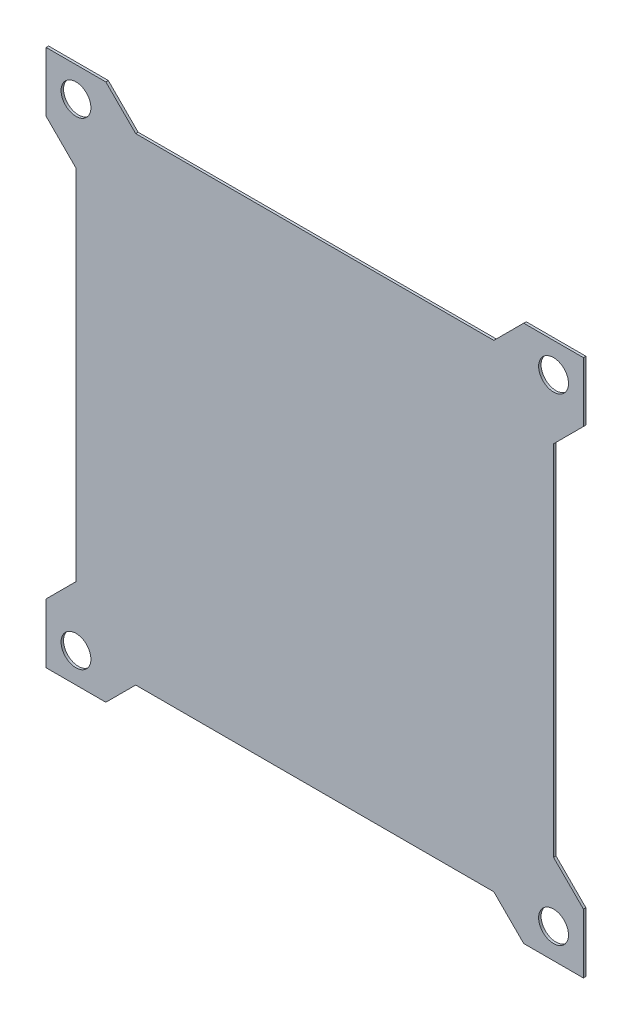
ISO-10303-21;
HEADER;
FILE_DESCRIPTION(('STEP AP214'),'2;1');
FILE_NAME('part.step','',(''),(''),'','','');
FILE_SCHEMA(('AUTOMOTIVE_DESIGN { 1 0 10303 214 1 1 1 1 }'));
ENDSEC;
DATA;
#1=APPLICATION_CONTEXT('core data for automotive mechanical design processes');
#2=APPLICATION_PROTOCOL_DEFINITION('international standard','automotive_design',2000,#1);
#3=PRODUCT_CONTEXT('',#1,'mechanical');
#4=PRODUCT('Part','Part','',(#3));
#5=PRODUCT_RELATED_PRODUCT_CATEGORY('part','',(#4));
#6=PRODUCT_DEFINITION_FORMATION('','',#4);
#7=PRODUCT_DEFINITION_CONTEXT('part definition',#1,'design');
#8=PRODUCT_DEFINITION('design','',#6,#7);
#9=PRODUCT_DEFINITION_SHAPE('','',#8);
#10=(LENGTH_UNIT() NAMED_UNIT(*) SI_UNIT(.MILLI.,.METRE.));
#11=(NAMED_UNIT(*) PLANE_ANGLE_UNIT() SI_UNIT($,.RADIAN.));
#12=(NAMED_UNIT(*) SI_UNIT($,.STERADIAN.) SOLID_ANGLE_UNIT());
#13=UNCERTAINTY_MEASURE_WITH_UNIT(LENGTH_MEASURE(1.E-05),#10,'distance_accuracy_value','');
#14=(GEOMETRIC_REPRESENTATION_CONTEXT(3) GLOBAL_UNCERTAINTY_ASSIGNED_CONTEXT((#13)) GLOBAL_UNIT_ASSIGNED_CONTEXT((#10,
#11,#12)) REPRESENTATION_CONTEXT('',''));
#15=CARTESIAN_POINT('',(0.,0.,0.));
#16=DIRECTION('',(0.,0.,1.));
#17=DIRECTION('',(1.,0.,0.));
#18=AXIS2_PLACEMENT_3D('',#15,#16,#17);
#19=CARTESIAN_POINT('',(90.,90.,0.41148));
#20=DIRECTION('',(-1.,0.,0.));
#21=DIRECTION('',(0.,0.,1.));
#22=AXIS2_PLACEMENT_3D('',#19,#20,#21);
#23=PLANE('',#22);
#24=DIRECTION('',(0.,1.,0.));
#25=VECTOR('',#24,1.);
#26=CARTESIAN_POINT('',(90.,90.,0.));
#27=LINE('',#26,#25);
#28=CARTESIAN_POINT('',(90.,80.,0.));
#29=VERTEX_POINT('',#28);
#30=CARTESIAN_POINT('',(90.,90.,0.));
#31=VERTEX_POINT('',#30);
#32=EDGE_CURVE('E3629',#29,#31,#27,.T.);
#33=ORIENTED_EDGE('',*,*,#32,.T.);
#34=DIRECTION('',(0.,0.,-1.));
#35=VECTOR('',#34,1.);
#36=CARTESIAN_POINT('',(90.,90.,0.41148));
#37=LINE('',#36,#35);
#38=CARTESIAN_POINT('',(90.,90.,0.41148));
#39=VERTEX_POINT('',#38);
#40=EDGE_CURVE('E3309',#39,#31,#37,.T.);
#41=ORIENTED_EDGE('',*,*,#40,.F.);
#42=DIRECTION('',(0.,1.,0.));
#43=VECTOR('',#42,1.);
#44=CARTESIAN_POINT('',(90.,90.,0.41148));
#45=LINE('',#44,#43);
#46=CARTESIAN_POINT('',(90.,80.,0.41148));
#47=VERTEX_POINT('',#46);
#48=EDGE_CURVE('E3688',#47,#39,#45,.T.);
#49=ORIENTED_EDGE('',*,*,#48,.F.);
#50=DIRECTION('',(0.,0.,-1.));
#51=VECTOR('',#50,1.);
#52=CARTESIAN_POINT('',(90.,80.,0.41148));
#53=LINE('',#52,#51);
#54=EDGE_CURVE('E3625',#47,#29,#53,.T.);
#55=ORIENTED_EDGE('',*,*,#54,.T.);
#56=EDGE_LOOP('',(#33,#41,#49,#55));
#57=FACE_BOUND('',#56,.T.);
#58=ADVANCED_FACE('F3456',(#57),#23,.F.);
#59=CARTESIAN_POINT('',(80.,90.,0.41148));
#60=DIRECTION('',(0.,-1.,0.));
#61=DIRECTION('',(0.,0.,-1.));
#62=AXIS2_PLACEMENT_3D('',#59,#60,#61);
#63=PLANE('',#62);
#64=DIRECTION('',(-1.,0.,0.));
#65=VECTOR('',#64,1.);
#66=CARTESIAN_POINT('',(80.,90.,0.));
#67=LINE('',#66,#65);
#68=CARTESIAN_POINT('',(80.,90.,0.));
#69=VERTEX_POINT('',#68);
#70=EDGE_CURVE('E3633',#31,#69,#67,.T.);
#71=ORIENTED_EDGE('',*,*,#70,.T.);
#72=DIRECTION('',(0.,0.,-1.));
#73=VECTOR('',#72,1.);
#74=CARTESIAN_POINT('',(80.,90.,0.41148));
#75=LINE('',#74,#73);
#76=CARTESIAN_POINT('',(80.,90.,0.41148));
#77=VERTEX_POINT('',#76);
#78=EDGE_CURVE('E3465',#77,#69,#75,.T.);
#79=ORIENTED_EDGE('',*,*,#78,.F.);
#80=DIRECTION('',(-1.,0.,0.));
#81=VECTOR('',#80,1.);
#82=CARTESIAN_POINT('',(80.,90.,0.41148));
#83=LINE('',#82,#81);
#84=EDGE_CURVE('E3552',#39,#77,#83,.T.);
#85=ORIENTED_EDGE('',*,*,#84,.F.);
#86=ORIENTED_EDGE('',*,*,#40,.T.);
#87=EDGE_LOOP('',(#71,#79,#85,#86));
#88=FACE_BOUND('',#87,.T.);
#89=ADVANCED_FACE('F3839',(#88),#63,.F.);
#90=CARTESIAN_POINT('',(75.,85.,0.41148));
#91=DIRECTION('',(0.707106781186546,-0.707106781186548,0.));
#92=DIRECTION('',(0.707106781186549,0.707106781186547,0.));
#93=AXIS2_PLACEMENT_3D('',#90,#91,#92);
#94=PLANE('',#93);
#95=DIRECTION('',(-0.707106781186548,-0.707106781186546,0.));
#96=VECTOR('',#95,1.);
#97=CARTESIAN_POINT('',(75.,85.,0.));
#98=LINE('',#97,#96);
#99=CARTESIAN_POINT('',(75.,85.,0.));
#100=VERTEX_POINT('',#99);
#101=EDGE_CURVE('E3637',#69,#100,#98,.T.);
#102=ORIENTED_EDGE('',*,*,#101,.T.);
#103=DIRECTION('',(0.,0.,-1.));
#104=VECTOR('',#103,1.);
#105=CARTESIAN_POINT('',(75.,85.,0.41148));
#106=LINE('',#105,#104);
#107=CARTESIAN_POINT('',(75.,85.,0.41148));
#108=VERTEX_POINT('',#107);
#109=EDGE_CURVE('E3747',#108,#100,#106,.T.);
#110=ORIENTED_EDGE('',*,*,#109,.F.);
#111=DIRECTION('',(-0.707106781186548,-0.707106781186546,0.));
#112=VECTOR('',#111,1.);
#113=CARTESIAN_POINT('',(75.,85.,0.41148));
#114=LINE('',#113,#112);
#115=EDGE_CURVE('E3757',#77,#108,#114,.T.);
#116=ORIENTED_EDGE('',*,*,#115,.F.);
#117=ORIENTED_EDGE('',*,*,#78,.T.);
#118=EDGE_LOOP('',(#102,#110,#116,#117));
#119=FACE_BOUND('',#118,.T.);
#120=ADVANCED_FACE('F3755',(#119),#94,.F.);
#121=CARTESIAN_POINT('',(15.,85.,0.41148));
#122=DIRECTION('',(0.,-1.,0.));
#123=DIRECTION('',(0.,0.,-1.));
#124=AXIS2_PLACEMENT_3D('',#121,#122,#123);
#125=PLANE('',#124);
#126=DIRECTION('',(-1.,0.,0.));
#127=VECTOR('',#126,1.);
#128=CARTESIAN_POINT('',(15.,85.,0.));
#129=LINE('',#128,#127);
#130=CARTESIAN_POINT('',(15.,85.,0.));
#131=VERTEX_POINT('',#130);
#132=EDGE_CURVE('E3640',#100,#131,#129,.T.);
#133=ORIENTED_EDGE('',*,*,#132,.T.);
#134=DIRECTION('',(0.,0.,-1.));
#135=VECTOR('',#134,1.);
#136=CARTESIAN_POINT('',(15.,85.,0.41148));
#137=LINE('',#136,#135);
#138=CARTESIAN_POINT('',(15.,85.,0.41148));
#139=VERTEX_POINT('',#138);
#140=EDGE_CURVE('E3743',#139,#131,#137,.T.);
#141=ORIENTED_EDGE('',*,*,#140,.F.);
#142=DIRECTION('',(-1.,0.,0.));
#143=VECTOR('',#142,1.);
#144=CARTESIAN_POINT('',(15.,85.,0.41148));
#145=LINE('',#144,#143);
#146=EDGE_CURVE('E3776',#108,#139,#145,.T.);
#147=ORIENTED_EDGE('',*,*,#146,.F.);
#148=ORIENTED_EDGE('',*,*,#109,.T.);
#149=EDGE_LOOP('',(#133,#141,#147,#148));
#150=FACE_BOUND('',#149,.T.);
#151=ADVANCED_FACE('F3766',(#150),#125,.F.);
#152=CARTESIAN_POINT('',(10.,90.,0.41148));
#153=DIRECTION('',(-0.707106781186547,-0.707106781186548,0.));
#154=DIRECTION('',(0.707106781186548,-0.707106781186547,0.));
#155=AXIS2_PLACEMENT_3D('',#152,#153,#154);
#156=PLANE('',#155);
#157=DIRECTION('',(-0.707106781186548,0.707106781186547,0.));
#158=VECTOR('',#157,1.);
#159=CARTESIAN_POINT('',(10.,90.,0.));
#160=LINE('',#159,#158);
#161=CARTESIAN_POINT('',(10.,90.,0.));
#162=VERTEX_POINT('',#161);
#163=EDGE_CURVE('E3643',#131,#162,#160,.T.);
#164=ORIENTED_EDGE('',*,*,#163,.T.);
#165=DIRECTION('',(0.,0.,-1.));
#166=VECTOR('',#165,1.);
#167=CARTESIAN_POINT('',(10.,90.,0.41148));
#168=LINE('',#167,#166);
#169=CARTESIAN_POINT('',(10.,90.,0.41148));
#170=VERTEX_POINT('',#169);
#171=EDGE_CURVE('E3739',#170,#162,#168,.T.);
#172=ORIENTED_EDGE('',*,*,#171,.F.);
#173=DIRECTION('',(-0.707106781186548,0.707106781186547,0.));
#174=VECTOR('',#173,1.);
#175=CARTESIAN_POINT('',(10.,90.,0.41148));
#176=LINE('',#175,#174);
#177=EDGE_CURVE('E3772',#139,#170,#176,.T.);
#178=ORIENTED_EDGE('',*,*,#177,.F.);
#179=ORIENTED_EDGE('',*,*,#140,.T.);
#180=EDGE_LOOP('',(#164,#172,#178,#179));
#181=FACE_BOUND('',#180,.T.);
#182=ADVANCED_FACE('F3770',(#181),#156,.F.);
#183=CARTESIAN_POINT('',(0.,90.,0.41148));
#184=DIRECTION('',(0.,-1.,0.));
#185=DIRECTION('',(0.,0.,-1.));
#186=AXIS2_PLACEMENT_3D('',#183,#184,#185);
#187=PLANE('',#186);
#188=DIRECTION('',(-1.,0.,0.));
#189=VECTOR('',#188,1.);
#190=CARTESIAN_POINT('',(0.,90.,0.));
#191=LINE('',#190,#189);
#192=CARTESIAN_POINT('',(0.,90.,0.));
#193=VERTEX_POINT('',#192);
#194=EDGE_CURVE('E3646',#162,#193,#191,.T.);
#195=ORIENTED_EDGE('',*,*,#194,.T.);
#196=DIRECTION('',(0.,0.,-1.));
#197=VECTOR('',#196,1.);
#198=CARTESIAN_POINT('',(0.,90.,0.41148));
#199=LINE('',#198,#197);
#200=CARTESIAN_POINT('',(0.,90.,0.41148));
#201=VERTEX_POINT('',#200);
#202=EDGE_CURVE('E3735',#201,#193,#199,.T.);
#203=ORIENTED_EDGE('',*,*,#202,.F.);
#204=DIRECTION('',(-1.,0.,0.));
#205=VECTOR('',#204,1.);
#206=CARTESIAN_POINT('',(0.,90.,0.41148));
#207=LINE('',#206,#205);
#208=EDGE_CURVE('E3775',#170,#201,#207,.T.);
#209=ORIENTED_EDGE('',*,*,#208,.F.);
#210=ORIENTED_EDGE('',*,*,#171,.T.);
#211=EDGE_LOOP('',(#195,#203,#209,#210));
#212=FACE_BOUND('',#211,.T.);
#213=ADVANCED_FACE('F3852',(#212),#187,.F.);
#214=CARTESIAN_POINT('',(0.,80.,0.41148));
#215=DIRECTION('',(1.,0.,0.));
#216=DIRECTION('',(0.,0.,-1.));
#217=AXIS2_PLACEMENT_3D('',#214,#215,#216);
#218=PLANE('',#217);
#219=DIRECTION('',(0.,-1.,0.));
#220=VECTOR('',#219,1.);
#221=CARTESIAN_POINT('',(0.,80.,0.));
#222=LINE('',#221,#220);
#223=CARTESIAN_POINT('',(0.,80.,0.));
#224=VERTEX_POINT('',#223);
#225=EDGE_CURVE('E3649',#193,#224,#222,.T.);
#226=ORIENTED_EDGE('',*,*,#225,.T.);
#227=DIRECTION('',(0.,0.,-1.));
#228=VECTOR('',#227,1.);
#229=CARTESIAN_POINT('',(0.,80.,0.41148));
#230=LINE('',#229,#228);
#231=CARTESIAN_POINT('',(0.,80.,0.41148));
#232=VERTEX_POINT('',#231);
#233=EDGE_CURVE('E3731',#232,#224,#230,.T.);
#234=ORIENTED_EDGE('',*,*,#233,.F.);
#235=DIRECTION('',(0.,-1.,0.));
#236=VECTOR('',#235,1.);
#237=CARTESIAN_POINT('',(0.,80.,0.41148));
#238=LINE('',#237,#236);
#239=EDGE_CURVE('E3780',#201,#232,#238,.T.);
#240=ORIENTED_EDGE('',*,*,#239,.F.);
#241=ORIENTED_EDGE('',*,*,#202,.T.);
#242=EDGE_LOOP('',(#226,#234,#240,#241));
#243=FACE_BOUND('',#242,.T.);
#244=ADVANCED_FACE('F3855',(#243),#218,.F.);
#245=CARTESIAN_POINT('',(5.,75.,0.41148));
#246=DIRECTION('',(0.707106781186548,0.707106781186547,0.));
#247=DIRECTION('',(-0.707106781186547,0.707106781186548,0.));
#248=AXIS2_PLACEMENT_3D('',#245,#246,#247);
#249=PLANE('',#248);
#250=DIRECTION('',(0.707106781186547,-0.707106781186548,0.));
#251=VECTOR('',#250,1.);
#252=CARTESIAN_POINT('',(5.,75.,0.));
#253=LINE('',#252,#251);
#254=CARTESIAN_POINT('',(5.,75.,0.));
#255=VERTEX_POINT('',#254);
#256=EDGE_CURVE('E3652',#224,#255,#253,.T.);
#257=ORIENTED_EDGE('',*,*,#256,.T.);
#258=DIRECTION('',(0.,0.,-1.));
#259=VECTOR('',#258,1.);
#260=CARTESIAN_POINT('',(5.,75.,0.41148));
#261=LINE('',#260,#259);
#262=CARTESIAN_POINT('',(5.,75.,0.41148));
#263=VERTEX_POINT('',#262);
#264=EDGE_CURVE('E3727',#263,#255,#261,.T.);
#265=ORIENTED_EDGE('',*,*,#264,.F.);
#266=DIRECTION('',(0.707106781186547,-0.707106781186548,0.));
#267=VECTOR('',#266,1.);
#268=CARTESIAN_POINT('',(5.,75.,0.41148));
#269=LINE('',#268,#267);
#270=EDGE_CURVE('E3787',#232,#263,#269,.T.);
#271=ORIENTED_EDGE('',*,*,#270,.F.);
#272=ORIENTED_EDGE('',*,*,#233,.T.);
#273=EDGE_LOOP('',(#257,#265,#271,#272));
#274=FACE_BOUND('',#273,.T.);
#275=ADVANCED_FACE('F3859',(#274),#249,.F.);
#276=CARTESIAN_POINT('',(5.,15.,0.41148));
#277=DIRECTION('',(1.,0.,0.));
#278=DIRECTION('',(0.,0.,-1.));
#279=AXIS2_PLACEMENT_3D('',#276,#277,#278);
#280=PLANE('',#279);
#281=DIRECTION('',(0.,-1.,0.));
#282=VECTOR('',#281,1.);
#283=CARTESIAN_POINT('',(5.,15.,0.));
#284=LINE('',#283,#282);
#285=CARTESIAN_POINT('',(5.,15.,0.));
#286=VERTEX_POINT('',#285);
#287=EDGE_CURVE('E3655',#255,#286,#284,.T.);
#288=ORIENTED_EDGE('',*,*,#287,.T.);
#289=DIRECTION('',(0.,0.,-1.));
#290=VECTOR('',#289,1.);
#291=CARTESIAN_POINT('',(5.,15.,0.41148));
#292=LINE('',#291,#290);
#293=CARTESIAN_POINT('',(5.,15.,0.41148));
#294=VERTEX_POINT('',#293);
#295=EDGE_CURVE('E3723',#294,#286,#292,.T.);
#296=ORIENTED_EDGE('',*,*,#295,.F.);
#297=DIRECTION('',(0.,-1.,0.));
#298=VECTOR('',#297,1.);
#299=CARTESIAN_POINT('',(5.,15.,0.41148));
#300=LINE('',#299,#298);
#301=EDGE_CURVE('E3790',#263,#294,#300,.T.);
#302=ORIENTED_EDGE('',*,*,#301,.F.);
#303=ORIENTED_EDGE('',*,*,#264,.T.);
#304=EDGE_LOOP('',(#288,#296,#302,#303));
#305=FACE_BOUND('',#304,.T.);
#306=ADVANCED_FACE('F3863',(#305),#280,.F.);
#307=CARTESIAN_POINT('',(0.,10.,0.41148));
#308=DIRECTION('',(0.707106781186547,-0.707106781186548,0.));
#309=DIRECTION('',(0.707106781186548,0.707106781186547,0.));
#310=AXIS2_PLACEMENT_3D('',#307,#308,#309);
#311=PLANE('',#310);
#312=DIRECTION('',(-0.707106781186548,-0.707106781186547,0.));
#313=VECTOR('',#312,1.);
#314=CARTESIAN_POINT('',(0.,10.,0.));
#315=LINE('',#314,#313);
#316=CARTESIAN_POINT('',(0.,10.,0.));
#317=VERTEX_POINT('',#316);
#318=EDGE_CURVE('E3658',#286,#317,#315,.T.);
#319=ORIENTED_EDGE('',*,*,#318,.T.);
#320=DIRECTION('',(0.,0.,-1.));
#321=VECTOR('',#320,1.);
#322=CARTESIAN_POINT('',(0.,10.,0.41148));
#323=LINE('',#322,#321);
#324=CARTESIAN_POINT('',(0.,10.,0.41148));
#325=VERTEX_POINT('',#324);
#326=EDGE_CURVE('E3719',#325,#317,#323,.T.);
#327=ORIENTED_EDGE('',*,*,#326,.F.);
#328=DIRECTION('',(-0.707106781186548,-0.707106781186547,0.));
#329=VECTOR('',#328,1.);
#330=CARTESIAN_POINT('',(0.,10.,0.41148));
#331=LINE('',#330,#329);
#332=EDGE_CURVE('E3793',#294,#325,#331,.T.);
#333=ORIENTED_EDGE('',*,*,#332,.F.);
#334=ORIENTED_EDGE('',*,*,#295,.T.);
#335=EDGE_LOOP('',(#319,#327,#333,#334));
#336=FACE_BOUND('',#335,.T.);
#337=ADVANCED_FACE('F3867',(#336),#311,.F.);
#338=CARTESIAN_POINT('',(0.,0.,0.41148));
#339=DIRECTION('',(1.,0.,0.));
#340=DIRECTION('',(0.,0.,-1.));
#341=AXIS2_PLACEMENT_3D('',#338,#339,#340);
#342=PLANE('',#341);
#343=DIRECTION('',(0.,-1.,0.));
#344=VECTOR('',#343,1.);
#345=CARTESIAN_POINT('',(0.,0.,0.));
#346=LINE('',#345,#344);
#347=CARTESIAN_POINT('',(0.,0.,0.));
#348=VERTEX_POINT('',#347);
#349=EDGE_CURVE('E3661',#317,#348,#346,.T.);
#350=ORIENTED_EDGE('',*,*,#349,.T.);
#351=DIRECTION('',(0.,0.,-1.));
#352=VECTOR('',#351,1.);
#353=CARTESIAN_POINT('',(0.,0.,0.41148));
#354=LINE('',#353,#352);
#355=CARTESIAN_POINT('',(0.,0.,0.41148));
#356=VERTEX_POINT('',#355);
#357=EDGE_CURVE('E3715',#356,#348,#354,.T.);
#358=ORIENTED_EDGE('',*,*,#357,.F.);
#359=DIRECTION('',(0.,-1.,0.));
#360=VECTOR('',#359,1.);
#361=CARTESIAN_POINT('',(0.,0.,0.41148));
#362=LINE('',#361,#360);
#363=EDGE_CURVE('E3796',#325,#356,#362,.T.);
#364=ORIENTED_EDGE('',*,*,#363,.F.);
#365=ORIENTED_EDGE('',*,*,#326,.T.);
#366=EDGE_LOOP('',(#350,#358,#364,#365));
#367=FACE_BOUND('',#366,.T.);
#368=ADVANCED_FACE('F3871',(#367),#342,.F.);
#369=CARTESIAN_POINT('',(10.,0.,0.41148));
#370=DIRECTION('',(0.,1.,0.));
#371=DIRECTION('',(0.,0.,1.));
#372=AXIS2_PLACEMENT_3D('',#369,#370,#371);
#373=PLANE('',#372);
#374=DIRECTION('',(1.,0.,0.));
#375=VECTOR('',#374,1.);
#376=CARTESIAN_POINT('',(10.,0.,0.));
#377=LINE('',#376,#375);
#378=CARTESIAN_POINT('',(10.,0.,0.));
#379=VERTEX_POINT('',#378);
#380=EDGE_CURVE('E3664',#348,#379,#377,.T.);
#381=ORIENTED_EDGE('',*,*,#380,.T.);
#382=DIRECTION('',(0.,0.,-1.));
#383=VECTOR('',#382,1.);
#384=CARTESIAN_POINT('',(10.,0.,0.41148));
#385=LINE('',#384,#383);
#386=CARTESIAN_POINT('',(10.,0.,0.41148));
#387=VERTEX_POINT('',#386);
#388=EDGE_CURVE('E3711',#387,#379,#385,.T.);
#389=ORIENTED_EDGE('',*,*,#388,.F.);
#390=DIRECTION('',(1.,0.,0.));
#391=VECTOR('',#390,1.);
#392=CARTESIAN_POINT('',(10.,0.,0.41148));
#393=LINE('',#392,#391);
#394=EDGE_CURVE('E3799',#356,#387,#393,.T.);
#395=ORIENTED_EDGE('',*,*,#394,.F.);
#396=ORIENTED_EDGE('',*,*,#357,.T.);
#397=EDGE_LOOP('',(#381,#389,#395,#396));
#398=FACE_BOUND('',#397,.T.);
#399=ADVANCED_FACE('F3875',(#398),#373,.F.);
#400=CARTESIAN_POINT('',(15.,5.,0.41148));
#401=DIRECTION('',(-0.707106781186548,0.707106781186547,0.));
#402=DIRECTION('',(-0.707106781186547,-0.707106781186548,0.));
#403=AXIS2_PLACEMENT_3D('',#400,#401,#402);
#404=PLANE('',#403);
#405=DIRECTION('',(0.707106781186547,0.707106781186548,0.));
#406=VECTOR('',#405,1.);
#407=CARTESIAN_POINT('',(15.,5.,0.));
#408=LINE('',#407,#406);
#409=CARTESIAN_POINT('',(15.,5.,0.));
#410=VERTEX_POINT('',#409);
#411=EDGE_CURVE('E3667',#379,#410,#408,.T.);
#412=ORIENTED_EDGE('',*,*,#411,.T.);
#413=DIRECTION('',(0.,0.,-1.));
#414=VECTOR('',#413,1.);
#415=CARTESIAN_POINT('',(15.,5.,0.41148));
#416=LINE('',#415,#414);
#417=CARTESIAN_POINT('',(15.,5.,0.41148));
#418=VERTEX_POINT('',#417);
#419=EDGE_CURVE('E3707',#418,#410,#416,.T.);
#420=ORIENTED_EDGE('',*,*,#419,.F.);
#421=DIRECTION('',(0.707106781186547,0.707106781186548,0.));
#422=VECTOR('',#421,1.);
#423=CARTESIAN_POINT('',(15.,5.,0.41148));
#424=LINE('',#423,#422);
#425=EDGE_CURVE('E3802',#387,#418,#424,.T.);
#426=ORIENTED_EDGE('',*,*,#425,.F.);
#427=ORIENTED_EDGE('',*,*,#388,.T.);
#428=EDGE_LOOP('',(#412,#420,#426,#427));
#429=FACE_BOUND('',#428,.T.);
#430=ADVANCED_FACE('F3879',(#429),#404,.F.);
#431=CARTESIAN_POINT('',(75.,5.,0.41148));
#432=DIRECTION('',(0.,1.,0.));
#433=DIRECTION('',(0.,0.,1.));
#434=AXIS2_PLACEMENT_3D('',#431,#432,#433);
#435=PLANE('',#434);
#436=DIRECTION('',(1.,0.,0.));
#437=VECTOR('',#436,1.);
#438=CARTESIAN_POINT('',(75.,5.,0.));
#439=LINE('',#438,#437);
#440=CARTESIAN_POINT('',(75.,5.,0.));
#441=VERTEX_POINT('',#440);
#442=EDGE_CURVE('E3670',#410,#441,#439,.T.);
#443=ORIENTED_EDGE('',*,*,#442,.T.);
#444=DIRECTION('',(0.,0.,-1.));
#445=VECTOR('',#444,1.);
#446=CARTESIAN_POINT('',(75.,5.,0.41148));
#447=LINE('',#446,#445);
#448=CARTESIAN_POINT('',(75.,5.,0.41148));
#449=VERTEX_POINT('',#448);
#450=EDGE_CURVE('E3703',#449,#441,#447,.T.);
#451=ORIENTED_EDGE('',*,*,#450,.F.);
#452=DIRECTION('',(1.,0.,0.));
#453=VECTOR('',#452,1.);
#454=CARTESIAN_POINT('',(75.,5.,0.41148));
#455=LINE('',#454,#453);
#456=EDGE_CURVE('E3805',#418,#449,#455,.T.);
#457=ORIENTED_EDGE('',*,*,#456,.F.);
#458=ORIENTED_EDGE('',*,*,#419,.T.);
#459=EDGE_LOOP('',(#443,#451,#457,#458));
#460=FACE_BOUND('',#459,.T.);
#461=ADVANCED_FACE('F3883',(#460),#435,.F.);
#462=CARTESIAN_POINT('',(80.,0.,0.41148));
#463=DIRECTION('',(0.707106781186547,0.707106781186548,0.));
#464=DIRECTION('',(-0.707106781186548,0.707106781186547,0.));
#465=AXIS2_PLACEMENT_3D('',#462,#463,#464);
#466=PLANE('',#465);
#467=DIRECTION('',(0.707106781186548,-0.707106781186547,0.));
#468=VECTOR('',#467,1.);
#469=CARTESIAN_POINT('',(80.,0.,0.));
#470=LINE('',#469,#468);
#471=CARTESIAN_POINT('',(80.,0.,0.));
#472=VERTEX_POINT('',#471);
#473=EDGE_CURVE('E3673',#441,#472,#470,.T.);
#474=ORIENTED_EDGE('',*,*,#473,.T.);
#475=DIRECTION('',(0.,0.,-1.));
#476=VECTOR('',#475,1.);
#477=CARTESIAN_POINT('',(80.,0.,0.41148));
#478=LINE('',#477,#476);
#479=CARTESIAN_POINT('',(80.,0.,0.41148));
#480=VERTEX_POINT('',#479);
#481=EDGE_CURVE('E3699',#480,#472,#478,.T.);
#482=ORIENTED_EDGE('',*,*,#481,.F.);
#483=DIRECTION('',(0.707106781186548,-0.707106781186547,0.));
#484=VECTOR('',#483,1.);
#485=CARTESIAN_POINT('',(80.,0.,0.41148));
#486=LINE('',#485,#484);
#487=EDGE_CURVE('E3808',#449,#480,#486,.T.);
#488=ORIENTED_EDGE('',*,*,#487,.F.);
#489=ORIENTED_EDGE('',*,*,#450,.T.);
#490=EDGE_LOOP('',(#474,#482,#488,#489));
#491=FACE_BOUND('',#490,.T.);
#492=ADVANCED_FACE('F3887',(#491),#466,.F.);
#493=CARTESIAN_POINT('',(90.,0.,0.41148));
#494=DIRECTION('',(0.,1.,0.));
#495=DIRECTION('',(0.,0.,1.));
#496=AXIS2_PLACEMENT_3D('',#493,#494,#495);
#497=PLANE('',#496);
#498=DIRECTION('',(1.,0.,0.));
#499=VECTOR('',#498,1.);
#500=CARTESIAN_POINT('',(90.,0.,0.));
#501=LINE('',#500,#499);
#502=CARTESIAN_POINT('',(90.,0.,0.));
#503=VERTEX_POINT('',#502);
#504=EDGE_CURVE('E3676',#472,#503,#501,.T.);
#505=ORIENTED_EDGE('',*,*,#504,.T.);
#506=DIRECTION('',(0.,0.,-1.));
#507=VECTOR('',#506,1.);
#508=CARTESIAN_POINT('',(90.,0.,0.41148));
#509=LINE('',#508,#507);
#510=CARTESIAN_POINT('',(90.,0.,0.41148));
#511=VERTEX_POINT('',#510);
#512=EDGE_CURVE('E3695',#511,#503,#509,.T.);
#513=ORIENTED_EDGE('',*,*,#512,.F.);
#514=DIRECTION('',(1.,0.,0.));
#515=VECTOR('',#514,1.);
#516=CARTESIAN_POINT('',(90.,0.,0.41148));
#517=LINE('',#516,#515);
#518=EDGE_CURVE('E3811',#480,#511,#517,.T.);
#519=ORIENTED_EDGE('',*,*,#518,.F.);
#520=ORIENTED_EDGE('',*,*,#481,.T.);
#521=EDGE_LOOP('',(#505,#513,#519,#520));
#522=FACE_BOUND('',#521,.T.);
#523=ADVANCED_FACE('F3819',(#522),#497,.F.);
#524=CARTESIAN_POINT('',(90.,10.,0.41148));
#525=DIRECTION('',(-1.,0.,0.));
#526=DIRECTION('',(0.,0.,1.));
#527=AXIS2_PLACEMENT_3D('',#524,#525,#526);
#528=PLANE('',#527);
#529=DIRECTION('',(0.,1.,0.));
#530=VECTOR('',#529,1.);
#531=CARTESIAN_POINT('',(90.,10.,0.));
#532=LINE('',#531,#530);
#533=CARTESIAN_POINT('',(90.,10.,0.));
#534=VERTEX_POINT('',#533);
#535=EDGE_CURVE('E3679',#503,#534,#532,.T.);
#536=ORIENTED_EDGE('',*,*,#535,.T.);
#537=DIRECTION('',(0.,0.,-1.));
#538=VECTOR('',#537,1.);
#539=CARTESIAN_POINT('',(90.,10.,0.41148));
#540=LINE('',#539,#538);
#541=CARTESIAN_POINT('',(90.,10.,0.41148));
#542=VERTEX_POINT('',#541);
#543=EDGE_CURVE('E3618',#542,#534,#540,.T.);
#544=ORIENTED_EDGE('',*,*,#543,.F.);
#545=DIRECTION('',(0.,1.,0.));
#546=VECTOR('',#545,1.);
#547=CARTESIAN_POINT('',(90.,10.,0.41148));
#548=LINE('',#547,#546);
#549=EDGE_CURVE('E3607',#511,#542,#548,.T.);
#550=ORIENTED_EDGE('',*,*,#549,.F.);
#551=ORIENTED_EDGE('',*,*,#512,.T.);
#552=EDGE_LOOP('',(#536,#544,#550,#551));
#553=FACE_BOUND('',#552,.T.);
#554=ADVANCED_FACE('F3823',(#553),#528,.F.);
#555=CARTESIAN_POINT('',(85.,15.,0.41148));
#556=DIRECTION('',(-0.707106781186548,-0.707106781186547,0.));
#557=DIRECTION('',(0.707106781186547,-0.707106781186548,0.));
#558=AXIS2_PLACEMENT_3D('',#555,#556,#557);
#559=PLANE('',#558);
#560=DIRECTION('',(-0.707106781186547,0.707106781186548,0.));
#561=VECTOR('',#560,1.);
#562=CARTESIAN_POINT('',(85.,15.,0.));
#563=LINE('',#562,#561);
#564=CARTESIAN_POINT('',(85.,15.,0.));
#565=VERTEX_POINT('',#564);
#566=EDGE_CURVE('E3616',#534,#565,#563,.T.);
#567=ORIENTED_EDGE('',*,*,#566,.T.);
#568=DIRECTION('',(0.,0.,-1.));
#569=VECTOR('',#568,1.);
#570=CARTESIAN_POINT('',(85.,15.,0.41148));
#571=LINE('',#570,#569);
#572=CARTESIAN_POINT('',(85.,15.,0.41148));
#573=VERTEX_POINT('',#572);
#574=EDGE_CURVE('E3613',#573,#565,#571,.T.);
#575=ORIENTED_EDGE('',*,*,#574,.F.);
#576=DIRECTION('',(-0.707106781186547,0.707106781186548,0.));
#577=VECTOR('',#576,1.);
#578=CARTESIAN_POINT('',(85.,15.,0.41148));
#579=LINE('',#578,#577);
#580=EDGE_CURVE('E3601',#542,#573,#579,.T.);
#581=ORIENTED_EDGE('',*,*,#580,.F.);
#582=ORIENTED_EDGE('',*,*,#543,.T.);
#583=EDGE_LOOP('',(#567,#575,#581,#582));
#584=FACE_BOUND('',#583,.T.);
#585=ADVANCED_FACE('F3614',(#584),#559,.F.);
#586=CARTESIAN_POINT('',(85.,75.,0.41148));
#587=DIRECTION('',(-1.,0.,0.));
#588=DIRECTION('',(0.,0.,1.));
#589=AXIS2_PLACEMENT_3D('',#586,#587,#588);
#590=PLANE('',#589);
#591=DIRECTION('',(0.,1.,0.));
#592=VECTOR('',#591,1.);
#593=CARTESIAN_POINT('',(85.,75.,0.));
#594=LINE('',#593,#592);
#595=CARTESIAN_POINT('',(85.,75.,0.));
#596=VERTEX_POINT('',#595);
#597=EDGE_CURVE('E3538',#565,#596,#594,.T.);
#598=ORIENTED_EDGE('',*,*,#597,.T.);
#599=DIRECTION('',(0.,0.,-1.));
#600=VECTOR('',#599,1.);
#601=CARTESIAN_POINT('',(85.,75.,0.41148));
#602=LINE('',#601,#600);
#603=CARTESIAN_POINT('',(85.,75.,0.41148));
#604=VERTEX_POINT('',#603);
#605=EDGE_CURVE('E3619',#604,#596,#602,.T.);
#606=ORIENTED_EDGE('',*,*,#605,.F.);
#607=DIRECTION('',(0.,1.,0.));
#608=VECTOR('',#607,1.);
#609=CARTESIAN_POINT('',(85.,75.,0.41148));
#610=LINE('',#609,#608);
#611=EDGE_CURVE('E3605',#573,#604,#610,.T.);
#612=ORIENTED_EDGE('',*,*,#611,.F.);
#613=ORIENTED_EDGE('',*,*,#574,.T.);
#614=EDGE_LOOP('',(#598,#606,#612,#613));
#615=FACE_BOUND('',#614,.T.);
#616=ADVANCED_FACE('F3621',(#615),#590,.F.);
#617=CARTESIAN_POINT('',(90.,80.,0.41148));
#618=DIRECTION('',(-0.707106781186548,0.707106781186546,0.));
#619=DIRECTION('',(-0.707106781186547,-0.707106781186549,0.));
#620=AXIS2_PLACEMENT_3D('',#617,#618,#619);
#621=PLANE('',#620);
#622=DIRECTION('',(0.707106781186546,0.707106781186548,0.));
#623=VECTOR('',#622,1.);
#624=CARTESIAN_POINT('',(90.,80.,0.));
#625=LINE('',#624,#623);
#626=EDGE_CURVE('E3544',#596,#29,#625,.T.);
#627=ORIENTED_EDGE('',*,*,#626,.T.);
#628=ORIENTED_EDGE('',*,*,#54,.F.);
#629=DIRECTION('',(0.707106781186546,0.707106781186548,0.));
#630=VECTOR('',#629,1.);
#631=CARTESIAN_POINT('',(90.,80.,0.41148));
#632=LINE('',#631,#630);
#633=EDGE_CURVE('E3473',#604,#47,#632,.T.);
#634=ORIENTED_EDGE('',*,*,#633,.F.);
#635=ORIENTED_EDGE('',*,*,#605,.T.);
#636=EDGE_LOOP('',(#627,#628,#634,#635));
#637=FACE_BOUND('',#636,.T.);
#638=ADVANCED_FACE('F3827',(#637),#621,.F.);
#639=CARTESIAN_POINT('',(0.,0.,0.41148));
#640=DIRECTION('',(0.,0.,-1.));
#641=DIRECTION('',(-1.,0.,0.));
#642=AXIS2_PLACEMENT_3D('',#639,#640,#641);
#643=PLANE('',#642);
#644=CARTESIAN_POINT('',(5.,5.,0.411480000000006));
#645=DIRECTION('',(0.,0.,-1.));
#646=DIRECTION('',(-1.,0.,0.));
#647=AXIS2_PLACEMENT_3D('',#644,#645,#646);
#648=CIRCLE('',#647,2.49999999999999);
#649=CARTESIAN_POINT('',(2.50000000000001,5.,0.411480000000006));
#650=VERTEX_POINT('',#649);
#651=EDGE_CURVE('E3970',#650,#650,#648,.T.);
#652=ORIENTED_EDGE('',*,*,#651,.T.);
#653=EDGE_LOOP('',(#652));
#654=FACE_BOUND('',#653,.T.);
#655=CARTESIAN_POINT('',(85.,5.,0.411480000000006));
#656=DIRECTION('',(0.,0.,-1.));
#657=DIRECTION('',(-1.,0.,0.));
#658=AXIS2_PLACEMENT_3D('',#655,#656,#657);
#659=CIRCLE('',#658,2.49999999999999);
#660=CARTESIAN_POINT('',(82.5,5.,0.411480000000006));
#661=VERTEX_POINT('',#660);
#662=EDGE_CURVE('E3983',#661,#661,#659,.T.);
#663=ORIENTED_EDGE('',*,*,#662,.T.);
#664=EDGE_LOOP('',(#663));
#665=FACE_BOUND('',#664,.T.);
#666=CARTESIAN_POINT('',(5.,85.,0.411480000000006));
#667=DIRECTION('',(0.,0.,-1.));
#668=DIRECTION('',(-1.,0.,0.));
#669=AXIS2_PLACEMENT_3D('',#666,#667,#668);
#670=CIRCLE('',#669,2.49999999999999);
#671=CARTESIAN_POINT('',(2.50000000000001,85.,0.411480000000006));
#672=VERTEX_POINT('',#671);
#673=EDGE_CURVE('E3991',#672,#672,#670,.T.);
#674=ORIENTED_EDGE('',*,*,#673,.T.);
#675=EDGE_LOOP('',(#674));
#676=FACE_BOUND('',#675,.T.);
#677=CARTESIAN_POINT('',(85.,85.,0.411480000000006));
#678=DIRECTION('',(0.,0.,-1.));
#679=DIRECTION('',(-1.,0.,0.));
#680=AXIS2_PLACEMENT_3D('',#677,#678,#679);
#681=CIRCLE('',#680,2.49999999999999);
#682=CARTESIAN_POINT('',(82.5,85.,0.411480000000006));
#683=VERTEX_POINT('',#682);
#684=EDGE_CURVE('E3634',#683,#683,#681,.T.);
#685=ORIENTED_EDGE('',*,*,#684,.T.);
#686=EDGE_LOOP('',(#685));
#687=FACE_BOUND('',#686,.T.);
#688=ORIENTED_EDGE('',*,*,#48,.T.);
#689=ORIENTED_EDGE('',*,*,#84,.T.);
#690=ORIENTED_EDGE('',*,*,#115,.T.);
#691=ORIENTED_EDGE('',*,*,#146,.T.);
#692=ORIENTED_EDGE('',*,*,#177,.T.);
#693=ORIENTED_EDGE('',*,*,#208,.T.);
#694=ORIENTED_EDGE('',*,*,#239,.T.);
#695=ORIENTED_EDGE('',*,*,#270,.T.);
#696=ORIENTED_EDGE('',*,*,#301,.T.);
#697=ORIENTED_EDGE('',*,*,#332,.T.);
#698=ORIENTED_EDGE('',*,*,#363,.T.);
#699=ORIENTED_EDGE('',*,*,#394,.T.);
#700=ORIENTED_EDGE('',*,*,#425,.T.);
#701=ORIENTED_EDGE('',*,*,#456,.T.);
#702=ORIENTED_EDGE('',*,*,#487,.T.);
#703=ORIENTED_EDGE('',*,*,#518,.T.);
#704=ORIENTED_EDGE('',*,*,#549,.T.);
#705=ORIENTED_EDGE('',*,*,#580,.T.);
#706=ORIENTED_EDGE('',*,*,#611,.T.);
#707=ORIENTED_EDGE('',*,*,#633,.T.);
#708=EDGE_LOOP('',(#688,#689,#690,#691,#692,#693,#694,#695,#696,#697,#698,#699,#700,#701,#702,
#703,#704,#705,#706,#707));
#709=FACE_BOUND('',#708,.T.);
#710=ADVANCED_FACE('F3603',(#654,#665,#676,#687,#709),#643,.F.);
#711=CARTESIAN_POINT('',(0.,0.,0.));
#712=DIRECTION('',(0.,0.,-1.));
#713=DIRECTION('',(-1.,0.,0.));
#714=AXIS2_PLACEMENT_3D('',#711,#712,#713);
#715=PLANE('',#714);
#716=CARTESIAN_POINT('',(5.,5.,0.));
#717=DIRECTION('',(0.,0.,-1.));
#718=DIRECTION('',(-1.,0.,0.));
#719=AXIS2_PLACEMENT_3D('',#716,#717,#718);
#720=CIRCLE('',#719,2.49999999999999);
#721=CARTESIAN_POINT('',(2.50000000000001,5.,0.));
#722=VERTEX_POINT('',#721);
#723=EDGE_CURVE('E3973',#722,#722,#720,.T.);
#724=ORIENTED_EDGE('',*,*,#723,.F.);
#725=EDGE_LOOP('',(#724));
#726=FACE_BOUND('',#725,.T.);
#727=CARTESIAN_POINT('',(85.,5.,0.));
#728=DIRECTION('',(0.,0.,-1.));
#729=DIRECTION('',(-1.,0.,0.));
#730=AXIS2_PLACEMENT_3D('',#727,#728,#729);
#731=CIRCLE('',#730,2.49999999999999);
#732=CARTESIAN_POINT('',(82.5,5.,0.));
#733=VERTEX_POINT('',#732);
#734=EDGE_CURVE('E3977',#733,#733,#731,.T.);
#735=ORIENTED_EDGE('',*,*,#734,.F.);
#736=EDGE_LOOP('',(#735));
#737=FACE_BOUND('',#736,.T.);
#738=CARTESIAN_POINT('',(5.,85.,0.));
#739=DIRECTION('',(0.,0.,-1.));
#740=DIRECTION('',(-1.,0.,0.));
#741=AXIS2_PLACEMENT_3D('',#738,#739,#740);
#742=CIRCLE('',#741,2.49999999999999);
#743=CARTESIAN_POINT('',(2.50000000000001,85.,0.));
#744=VERTEX_POINT('',#743);
#745=EDGE_CURVE('E3987',#744,#744,#742,.T.);
#746=ORIENTED_EDGE('',*,*,#745,.F.);
#747=EDGE_LOOP('',(#746));
#748=FACE_BOUND('',#747,.T.);
#749=CARTESIAN_POINT('',(85.,85.,0.));
#750=DIRECTION('',(0.,0.,-1.));
#751=DIRECTION('',(-1.,0.,0.));
#752=AXIS2_PLACEMENT_3D('',#749,#750,#751);
#753=CIRCLE('',#752,2.49999999999999);
#754=CARTESIAN_POINT('',(82.5,85.,0.));
#755=VERTEX_POINT('',#754);
#756=EDGE_CURVE('E3995',#755,#755,#753,.T.);
#757=ORIENTED_EDGE('',*,*,#756,.F.);
#758=EDGE_LOOP('',(#757));
#759=FACE_BOUND('',#758,.T.);
#760=ORIENTED_EDGE('',*,*,#32,.F.);
#761=ORIENTED_EDGE('',*,*,#626,.F.);
#762=ORIENTED_EDGE('',*,*,#597,.F.);
#763=ORIENTED_EDGE('',*,*,#566,.F.);
#764=ORIENTED_EDGE('',*,*,#535,.F.);
#765=ORIENTED_EDGE('',*,*,#504,.F.);
#766=ORIENTED_EDGE('',*,*,#473,.F.);
#767=ORIENTED_EDGE('',*,*,#442,.F.);
#768=ORIENTED_EDGE('',*,*,#411,.F.);
#769=ORIENTED_EDGE('',*,*,#380,.F.);
#770=ORIENTED_EDGE('',*,*,#349,.F.);
#771=ORIENTED_EDGE('',*,*,#318,.F.);
#772=ORIENTED_EDGE('',*,*,#287,.F.);
#773=ORIENTED_EDGE('',*,*,#256,.F.);
#774=ORIENTED_EDGE('',*,*,#225,.F.);
#775=ORIENTED_EDGE('',*,*,#194,.F.);
#776=ORIENTED_EDGE('',*,*,#163,.F.);
#777=ORIENTED_EDGE('',*,*,#132,.F.);
#778=ORIENTED_EDGE('',*,*,#101,.F.);
#779=ORIENTED_EDGE('',*,*,#70,.F.);
#780=EDGE_LOOP('',(#760,#761,#762,#763,#764,#765,#766,#767,#768,#769,#770,#771,#772,#773,#774,
#775,#776,#777,#778,#779));
#781=FACE_BOUND('',#780,.T.);
#782=ADVANCED_FACE('F3761',(#726,#737,#748,#759,#781),#715,.T.);
#783=CARTESIAN_POINT('',(85.,85.,0.));
#784=DIRECTION('',(0.,0.,-1.));
#785=DIRECTION('',(-1.,0.,0.));
#786=AXIS2_PLACEMENT_3D('',#783,#784,#785);
#787=CYLINDRICAL_SURFACE('',#786,2.49999999999999);
#788=ORIENTED_EDGE('',*,*,#684,.F.);
#789=EDGE_LOOP('',(#788));
#790=FACE_BOUND('',#789,.T.);
#791=ORIENTED_EDGE('',*,*,#756,.T.);
#792=EDGE_LOOP('',(#791));
#793=FACE_BOUND('',#792,.T.);
#794=ADVANCED_FACE('F3915',(#790,#793),#787,.F.);
#795=CARTESIAN_POINT('',(5.,85.,0.));
#796=DIRECTION('',(0.,0.,-1.));
#797=DIRECTION('',(-1.,0.,0.));
#798=AXIS2_PLACEMENT_3D('',#795,#796,#797);
#799=CYLINDRICAL_SURFACE('',#798,2.49999999999999);
#800=ORIENTED_EDGE('',*,*,#673,.F.);
#801=EDGE_LOOP('',(#800));
#802=FACE_BOUND('',#801,.T.);
#803=ORIENTED_EDGE('',*,*,#745,.T.);
#804=EDGE_LOOP('',(#803));
#805=FACE_BOUND('',#804,.T.);
#806=ADVANCED_FACE('F3920',(#802,#805),#799,.F.);
#807=CARTESIAN_POINT('',(85.,5.,0.));
#808=DIRECTION('',(0.,0.,-1.));
#809=DIRECTION('',(-1.,0.,0.));
#810=AXIS2_PLACEMENT_3D('',#807,#808,#809);
#811=CYLINDRICAL_SURFACE('',#810,2.49999999999999);
#812=ORIENTED_EDGE('',*,*,#662,.F.);
#813=EDGE_LOOP('',(#812));
#814=FACE_BOUND('',#813,.T.);
#815=ORIENTED_EDGE('',*,*,#734,.T.);
#816=EDGE_LOOP('',(#815));
#817=FACE_BOUND('',#816,.T.);
#818=ADVANCED_FACE('F3932',(#814,#817),#811,.F.);
#819=CARTESIAN_POINT('',(5.,5.,0.));
#820=DIRECTION('',(0.,0.,-1.));
#821=DIRECTION('',(-1.,0.,0.));
#822=AXIS2_PLACEMENT_3D('',#819,#820,#821);
#823=CYLINDRICAL_SURFACE('',#822,2.49999999999999);
#824=ORIENTED_EDGE('',*,*,#651,.F.);
#825=EDGE_LOOP('',(#824));
#826=FACE_BOUND('',#825,.T.);
#827=ORIENTED_EDGE('',*,*,#723,.T.);
#828=EDGE_LOOP('',(#827));
#829=FACE_BOUND('',#828,.T.);
#830=ADVANCED_FACE('F3942',(#826,#829),#823,.F.);
#831=CLOSED_SHELL('',(#58,#89,#120,#151,#182,#213,#244,#275,#306,#337,#368,#399,#430,#461,#492,
#523,#554,#585,#616,#638,#710,#782,#794,#806,#818,#830));
#832=MANIFOLD_SOLID_BREP('B3149',#831);
#833=ADVANCED_BREP_SHAPE_REPRESENTATION('',(#18,#832),#14);
#834=SHAPE_DEFINITION_REPRESENTATION(#9,#833);
ENDSEC;
END-ISO-10303-21;
